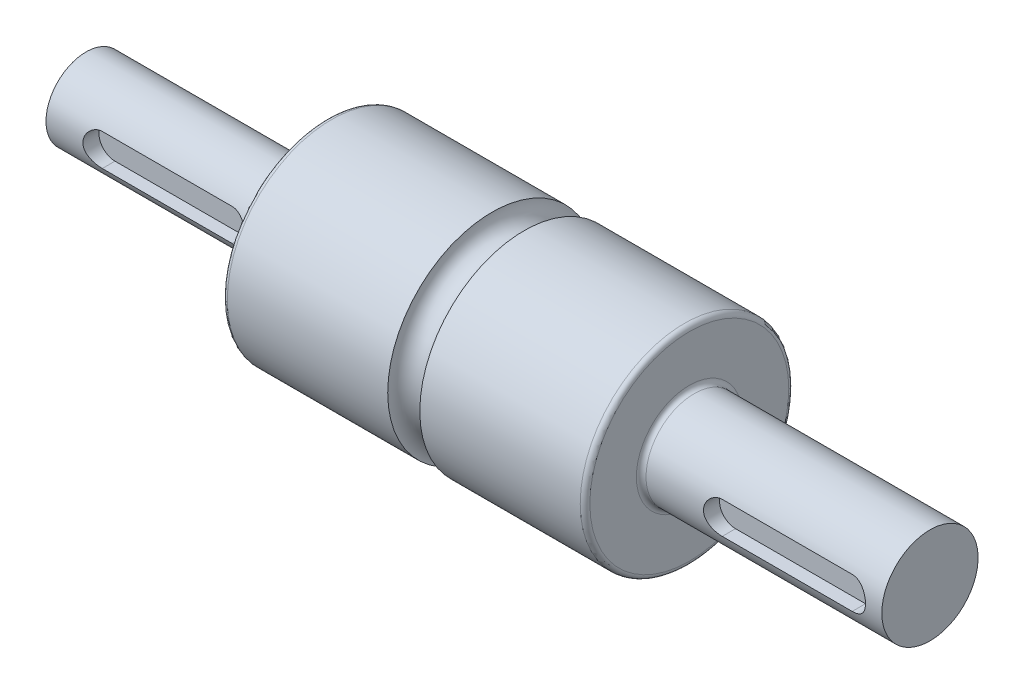
ISO-10303-21;
HEADER;
FILE_DESCRIPTION(('STEP AP214'),'2;1');
FILE_NAME('part.step','',(''),(''),'','','');
FILE_SCHEMA(('AUTOMOTIVE_DESIGN { 1 0 10303 214 1 1 1 1 }'));
ENDSEC;
DATA;
#1=APPLICATION_CONTEXT('core data for automotive mechanical design processes');
#2=APPLICATION_PROTOCOL_DEFINITION('international standard','automotive_design',2000,#1);
#3=PRODUCT_CONTEXT('',#1,'mechanical');
#4=PRODUCT('Part','Part','',(#3));
#5=PRODUCT_RELATED_PRODUCT_CATEGORY('part','',(#4));
#6=PRODUCT_DEFINITION_FORMATION('','',#4);
#7=PRODUCT_DEFINITION_CONTEXT('part definition',#1,'design');
#8=PRODUCT_DEFINITION('design','',#6,#7);
#9=PRODUCT_DEFINITION_SHAPE('','',#8);
#10=(LENGTH_UNIT() NAMED_UNIT(*) SI_UNIT(.MILLI.,.METRE.));
#11=(NAMED_UNIT(*) PLANE_ANGLE_UNIT() SI_UNIT($,.RADIAN.));
#12=(NAMED_UNIT(*) SI_UNIT($,.STERADIAN.) SOLID_ANGLE_UNIT());
#13=UNCERTAINTY_MEASURE_WITH_UNIT(LENGTH_MEASURE(1.E-05),#10,'distance_accuracy_value','');
#14=(GEOMETRIC_REPRESENTATION_CONTEXT(3) GLOBAL_UNCERTAINTY_ASSIGNED_CONTEXT((#13)) GLOBAL_UNIT_ASSIGNED_CONTEXT((#10,
#11,#12)) REPRESENTATION_CONTEXT('',''));
#15=CARTESIAN_POINT('',(0.,0.,0.));
#16=DIRECTION('',(0.,0.,1.));
#17=DIRECTION('',(1.,0.,0.));
#18=AXIS2_PLACEMENT_3D('',#15,#16,#17);
#19=CARTESIAN_POINT('',(-131.5,0.,0.));
#20=DIRECTION('',(-1.,0.,0.));
#21=DIRECTION('',(0.,0.,1.));
#22=AXIS2_PLACEMENT_3D('',#19,#20,#21);
#23=CYLINDRICAL_SURFACE('',#22,12.5);
#24=CARTESIAN_POINT('',(-58.,0.,0.));
#25=DIRECTION('',(-1.,0.,0.));
#26=DIRECTION('',(0.,0.,1.));
#27=AXIS2_PLACEMENT_3D('',#24,#25,#26);
#28=CIRCLE('',#27,12.5);
#29=CARTESIAN_POINT('',(-58.,0.,12.5));
#30=VERTEX_POINT('',#29);
#31=EDGE_CURVE('E153',#30,#30,#28,.T.);
#32=ORIENTED_EDGE('',*,*,#31,.T.);
#33=EDGE_LOOP('',(#32));
#34=FACE_BOUND('',#33,.T.);
#35=CARTESIAN_POINT('',(-131.5,0.,0.));
#36=DIRECTION('',(-1.,0.,0.));
#37=DIRECTION('',(0.,0.,1.));
#38=AXIS2_PLACEMENT_3D('',#35,#36,#37);
#39=CIRCLE('',#38,12.5);
#40=CARTESIAN_POINT('',(-131.5,0.,12.5));
#41=VERTEX_POINT('',#40);
#42=EDGE_CURVE('E143',#41,#41,#39,.T.);
#43=ORIENTED_EDGE('',*,*,#42,.F.);
#44=EDGE_LOOP('',(#43));
#45=FACE_BOUND('',#44,.T.);
#46=CARTESIAN_POINT('',(-74.5,-5.,11.4564392373896));
#47=CARTESIAN_POINT('',(-74.3654875679393,-5.00002116024616,11.4564109509945));
#48=CARTESIAN_POINT('',(-74.2309869354604,-4.99457288869912,11.4588073206432));
#49=CARTESIAN_POINT('',(-73.9630706553256,-4.97289704500258,11.4682409636927));
#50=CARTESIAN_POINT('',(-73.829654614021,-4.956673578293,11.4752764695362));
#51=CARTESIAN_POINT('',(-73.565385135065,-4.91369129558914,11.4937439172796));
#52=CARTESIAN_POINT('',(-73.434523688102,-4.88697412617558,11.5051584758264));
#53=CARTESIAN_POINT('',(-73.1757404220352,-4.82328654884511,11.5320036246689));
#54=CARTESIAN_POINT('',(-73.0478187828872,-4.78631551505478,11.5474344601058));
#55=CARTESIAN_POINT('',(-72.7959206323767,-4.70252103978111,11.5818106822086));
#56=CARTESIAN_POINT('',(-72.6719391040064,-4.65571075709793,11.6007513709062));
#57=CARTESIAN_POINT('',(-72.4284712713783,-4.55261160789531,11.6415978912418));
#58=CARTESIAN_POINT('',(-72.3089866777911,-4.49631917799879,11.6635048369856));
#59=CARTESIAN_POINT('',(-71.9581897596147,-4.31376922877803,11.7327894866887));
#60=CARTESIAN_POINT('',(-71.7345173617548,-4.1738333730516,11.7837334464308));
#61=CARTESIAN_POINT('',(-71.3017980191423,-3.85328699437733,11.8925290853841));
#62=CARTESIAN_POINT('',(-71.0940908043745,-3.67095756312248,11.9506010980043));
#63=CARTESIAN_POINT('',(-70.7111404708298,-3.27420643347806,12.0653248053599));
#64=CARTESIAN_POINT('',(-70.53590401691,-3.05977816286379,12.1219762064459));
#65=CARTESIAN_POINT('',(-70.2978547901685,-2.71343385084917,12.2025476404464));
#66=CARTESIAN_POINT('',(-70.2214331506581,-2.59127203287559,12.229134001304));
#67=CARTESIAN_POINT('',(-70.0792212452284,-2.34039970046137,12.2796116610866));
#68=CARTESIAN_POINT('',(-70.0134265986883,-2.21169191329333,12.3035040692708));
#69=CARTESIAN_POINT('',(-69.8930444134802,-1.94856415474308,12.3479110926869));
#70=CARTESIAN_POINT('',(-69.8384580797531,-1.81414357108402,12.3684253447059));
#71=CARTESIAN_POINT('',(-69.7410599466892,-1.54063203940549,12.4054617264858));
#72=CARTESIAN_POINT('',(-69.6982424200689,-1.4015434002045,12.4219857975888));
#73=CARTESIAN_POINT('',(-69.6265804994886,-1.12649875188941,12.4498667432373));
#74=CARTESIAN_POINT('',(-69.5971639159328,-0.990712972335591,12.4614336192513));
#75=CARTESIAN_POINT('',(-69.5497158745245,-0.716923447431963,12.480177753411));
#76=CARTESIAN_POINT('',(-69.5316794352604,-0.578920699676963,12.4873569321328));
#77=CARTESIAN_POINT('',(-69.5071744672548,-0.30174292808369,12.4971268844119));
#78=CARTESIAN_POINT('',(-69.5007048393492,-0.162568016896006,12.4997180939517));
#79=CARTESIAN_POINT('',(-69.4994043250122,0.115842484012891,12.5002382405049));
#80=CARTESIAN_POINT('',(-69.5045730295164,0.255078071429478,12.4981673413824));
#81=CARTESIAN_POINT('',(-69.5258691853457,0.524651970400596,12.4896713366005));
#82=CARTESIAN_POINT('',(-69.5413617516848,0.655048966944773,12.4834985427991));
#83=CARTESIAN_POINT('',(-69.5825047096151,0.914022837957911,12.4672131439381));
#84=CARTESIAN_POINT('',(-69.6081584769187,1.04259909282981,12.4570992295938));
#85=CARTESIAN_POINT('',(-69.6693736722391,1.29697755626972,12.4331876533791));
#86=CARTESIAN_POINT('',(-69.7049316760065,1.4227807074059,12.4193912647406));
#87=CARTESIAN_POINT('',(-69.7856340431202,1.67086757221276,12.3884570972524));
#88=CARTESIAN_POINT('',(-69.830782047088,1.79314992921958,12.3713180496423));
#89=CARTESIAN_POINT('',(-69.9815458342561,2.15709687028237,12.3149325863107));
#90=CARTESIAN_POINT('',(-70.1016086222678,2.39225143382088,12.2710729537441));
#91=CARTESIAN_POINT('',(-70.3761759563323,2.83955938188382,12.175361464094));
#92=CARTESIAN_POINT('',(-70.5306925854217,3.05170465810884,12.1235068051106));
#93=CARTESIAN_POINT('',(-70.881596586143,3.46189166322706,12.0130472510456));
#94=CARTESIAN_POINT('',(-71.0800653571789,3.65809600081914,11.9542226888217));
#95=CARTESIAN_POINT('',(-71.5074910854606,4.01527141902245,11.8390417472991));
#96=CARTESIAN_POINT('',(-71.736461856538,4.17622644798532,11.7826865017702));
#97=CARTESIAN_POINT('',(-72.1020444660322,4.38982639253539,11.7040767056709));
#98=CARTESIAN_POINT('',(-72.2295897678493,4.45714070918036,11.67853963431));
#99=CARTESIAN_POINT('',(-72.4904903947145,4.58068459393734,11.6306369662179));
#100=CARTESIAN_POINT('',(-72.6238431849912,4.63691894003213,11.6082700036232));
#101=CARTESIAN_POINT('',(-72.8952861568295,4.73770315812053,11.5675031334143));
#102=CARTESIAN_POINT('',(-73.0333702108564,4.78226754199411,11.5490983039106));
#103=CARTESIAN_POINT('',(-73.3133354618804,4.85931060760166,11.5168933461878));
#104=CARTESIAN_POINT('',(-73.4552149257571,4.89179470795396,11.5030911537407));
#105=CARTESIAN_POINT('',(-73.7468068086629,4.94524241843461,11.4802224777034));
#106=CARTESIAN_POINT('',(-73.8966177429504,4.96575156895815,11.4713433844497));
#107=CARTESIAN_POINT('',(-74.1976136616756,4.9931431059651,11.4594310700134));
#108=CARTESIAN_POINT('',(-74.3487977416618,5.0000338891365,11.4563942466884));
#109=CARTESIAN_POINT('',(-74.5,5.,11.4564392373896));
#110=B_SPLINE_CURVE_WITH_KNOTS('',3,(#46,#47,#48,#49,#50,#51,#52,#53,#54,#55,#56,#57,#58,#59,
#60,#61,#62,#63,#64,#65,#66,#67,#68,#69,#70,#71,#72,#73,#74,#75,#76,#77,#78,#79,#80,#81,#82,#83,
#84,#85,#86,#87,#88,#89,#90,#91,#92,#93,#94,#95,#96,#97,#98,#99,#100,#101,#102,#103,#104,#105,
#106,#107,#108,#109),.UNSPECIFIED.,.F.,.F.,(4,2,2,2,2,2,2,2,2,2,2,2,2,2,2,2,2,2,2,2,2,2,2,2,2,2,
2,2,2,2,2,4),(0.,0.403387132772953,0.806620659758034,1.20826977817943,1.60994341778078,
2.01108324721979,2.4123741621189,3.21490253133681,4.05861785764907,4.90250617122559,
5.34163056425766,5.780573478467,6.21956355621627,6.6583396199058,7.0760486126647,
7.49357463528175,7.91106097937957,8.32853264988812,8.72244552722558,9.11648937858482,
9.51039716361132,9.90445475472554,10.7036301452728,11.5030862504097,12.3549725889497,
13.2072460521693,13.6461605184396,14.0848852966823,14.5230618911476,14.9610417034976,
15.4147136276398,15.8681057435335),.UNSPECIFIED.);
#111=CARTESIAN_POINT('',(-74.5,-5.,11.4564392373896));
#112=VERTEX_POINT('',#111);
#113=CARTESIAN_POINT('',(-74.5,5.,11.4564392373896));
#114=VERTEX_POINT('',#113);
#115=EDGE_CURVE('E186',#112,#114,#110,.T.);
#116=ORIENTED_EDGE('',*,*,#115,.F.);
#117=DIRECTION('',(-1.,0.,0.));
#118=VECTOR('',#117,1.);
#119=CARTESIAN_POINT('',(-131.5,-5.,11.4564392373896));
#120=LINE('',#119,#118);
#121=CARTESIAN_POINT('',(-115.,-5.,11.4564392373896));
#122=VERTEX_POINT('',#121);
#123=EDGE_CURVE('E219',#112,#122,#120,.T.);
#124=ORIENTED_EDGE('',*,*,#123,.T.);
#125=CARTESIAN_POINT('',(-115.,-5.,11.4564392373896));
#126=CARTESIAN_POINT('',(-115.134512432061,-5.00002116024616,11.4564109509945));
#127=CARTESIAN_POINT('',(-115.26901306454,-4.99457288869912,11.4588073206432));
#128=CARTESIAN_POINT('',(-115.536929344674,-4.97289704500258,11.4682409636927));
#129=CARTESIAN_POINT('',(-115.670345385979,-4.956673578293,11.4752764695362));
#130=CARTESIAN_POINT('',(-115.934614864935,-4.91369129558914,11.4937439172796));
#131=CARTESIAN_POINT('',(-116.065476311898,-4.88697412617558,11.5051584758264));
#132=CARTESIAN_POINT('',(-116.324259577965,-4.82328654884511,11.5320036246689));
#133=CARTESIAN_POINT('',(-116.452181217113,-4.78631551505478,11.5474344601058));
#134=CARTESIAN_POINT('',(-116.704079367623,-4.70252103978111,11.5818106822086));
#135=CARTESIAN_POINT('',(-116.828060895994,-4.65571075709793,11.6007513709062));
#136=CARTESIAN_POINT('',(-117.071528728622,-4.5526116078953,11.6415978912418));
#137=CARTESIAN_POINT('',(-117.191013322209,-4.49631917799879,11.6635048369856));
#138=CARTESIAN_POINT('',(-117.541810240385,-4.31376922877802,11.7327894866887));
#139=CARTESIAN_POINT('',(-117.765482638245,-4.1738333730516,11.7837334464308));
#140=CARTESIAN_POINT('',(-118.198201980858,-3.85328699437734,11.8925290853841));
#141=CARTESIAN_POINT('',(-118.405909195625,-3.67095756312248,11.9506010980043));
#142=CARTESIAN_POINT('',(-118.78885952917,-3.27420643347806,12.0653248053599));
#143=CARTESIAN_POINT('',(-118.96409598309,-3.05977816286379,12.1219762064459));
#144=CARTESIAN_POINT('',(-119.202145209832,-2.71343385084917,12.2025476404464));
#145=CARTESIAN_POINT('',(-119.278566849342,-2.59127203287559,12.229134001304));
#146=CARTESIAN_POINT('',(-119.420778754772,-2.34039970046137,12.2796116610866));
#147=CARTESIAN_POINT('',(-119.486573401312,-2.21169191329333,12.3035040692708));
#148=CARTESIAN_POINT('',(-119.60695558652,-1.94856415474308,12.3479110926869));
#149=CARTESIAN_POINT('',(-119.661541920247,-1.81414357108402,12.3684253447059));
#150=CARTESIAN_POINT('',(-119.758940053311,-1.54063203940549,12.4054617264858));
#151=CARTESIAN_POINT('',(-119.801757579931,-1.4015434002045,12.4219857975888));
#152=CARTESIAN_POINT('',(-119.873419500511,-1.12649875188941,12.4498667432373));
#153=CARTESIAN_POINT('',(-119.902836084067,-0.990712972335592,12.4614336192513));
#154=CARTESIAN_POINT('',(-119.950284125476,-0.716923447431964,12.480177753411));
#155=CARTESIAN_POINT('',(-119.96832056474,-0.578920699676964,12.4873569321328));
#156=CARTESIAN_POINT('',(-119.992825532745,-0.30174292808369,12.4971268844119));
#157=CARTESIAN_POINT('',(-119.999295160651,-0.162568016896007,12.4997180939517));
#158=CARTESIAN_POINT('',(-120.000595674988,0.115842484012891,12.5002382405049));
#159=CARTESIAN_POINT('',(-119.995426970484,0.255078071429478,12.4981673413824));
#160=CARTESIAN_POINT('',(-119.974130814654,0.524651970400596,12.4896713366005));
#161=CARTESIAN_POINT('',(-119.958638248315,0.655048966944773,12.4834985427991));
#162=CARTESIAN_POINT('',(-119.917495290385,0.91402283795791,12.4672131439381));
#163=CARTESIAN_POINT('',(-119.891841523081,1.04259909282981,12.4570992295938));
#164=CARTESIAN_POINT('',(-119.830626327761,1.29697755626972,12.4331876533791));
#165=CARTESIAN_POINT('',(-119.795068323994,1.42278070740589,12.4193912647406));
#166=CARTESIAN_POINT('',(-119.71436595688,1.67086757221276,12.3884570972524));
#167=CARTESIAN_POINT('',(-119.669217952912,1.79314992921958,12.3713180496423));
#168=CARTESIAN_POINT('',(-119.518454165744,2.15709687028237,12.3149325863107));
#169=CARTESIAN_POINT('',(-119.398391377732,2.39225143382088,12.2710729537441));
#170=CARTESIAN_POINT('',(-119.123824043668,2.83955938188382,12.175361464094));
#171=CARTESIAN_POINT('',(-118.969307414578,3.05170465810884,12.1235068051106));
#172=CARTESIAN_POINT('',(-118.618403413857,3.46189166322706,12.0130472510456));
#173=CARTESIAN_POINT('',(-118.419934642821,3.65809600081914,11.9542226888217));
#174=CARTESIAN_POINT('',(-117.992508914539,4.01527141902245,11.8390417472991));
#175=CARTESIAN_POINT('',(-117.763538143462,4.17622644798532,11.7826865017702));
#176=CARTESIAN_POINT('',(-117.397955533968,4.38982639253539,11.7040767056709));
#177=CARTESIAN_POINT('',(-117.270410232151,4.45714070918036,11.67853963431));
#178=CARTESIAN_POINT('',(-117.009509605286,4.58068459393734,11.6306369662179));
#179=CARTESIAN_POINT('',(-116.876156815009,4.63691894003213,11.6082700036232));
#180=CARTESIAN_POINT('',(-116.60471384317,4.73770315812053,11.5675031334143));
#181=CARTESIAN_POINT('',(-116.466629789144,4.78226754199411,11.5490983039106));
#182=CARTESIAN_POINT('',(-116.18666453812,4.85931060760166,11.5168933461878));
#183=CARTESIAN_POINT('',(-116.044785074243,4.89179470795396,11.5030911537407));
#184=CARTESIAN_POINT('',(-115.753193191337,4.94524241843461,11.4802224777034));
#185=CARTESIAN_POINT('',(-115.60338225705,4.96575156895815,11.4713433844497));
#186=CARTESIAN_POINT('',(-115.302386338324,4.9931431059651,11.4594310700134));
#187=CARTESIAN_POINT('',(-115.151202258338,5.0000338891365,11.4563942466884));
#188=CARTESIAN_POINT('',(-115.,5.,11.4564392373896));
#189=B_SPLINE_CURVE_WITH_KNOTS('',3,(#125,#126,#127,#128,#129,#130,#131,#132,#133,#134,#135,
#136,#137,#138,#139,#140,#141,#142,#143,#144,#145,#146,#147,#148,#149,#150,#151,#152,#153,#154,
#155,#156,#157,#158,#159,#160,#161,#162,#163,#164,#165,#166,#167,#168,#169,#170,#171,#172,#173,
#174,#175,#176,#177,#178,#179,#180,#181,#182,#183,#184,#185,#186,#187,#188),.UNSPECIFIED.,.F.,
.F.,(4,2,2,2,2,2,2,2,2,2,2,2,2,2,2,2,2,2,2,2,2,2,2,2,2,2,2,2,2,2,2,4),(0.,0.403387132772953,
0.806620659758034,1.20826977817943,1.60994341778078,2.01108324721979,2.41237416211891,
3.21490253133681,4.05861785764907,4.90250617122559,5.34163056425766,5.780573478467,
6.21956355621626,6.6583396199058,7.0760486126647,7.49357463528175,7.91106097937957,
8.32853264988812,8.72244552722558,9.11648937858482,9.51039716361132,9.90445475472554,
10.7036301452728,11.5030862504097,12.3549725889497,13.2072460521693,13.6461605184396,
14.0848852966823,14.5230618911476,14.9610417034976,15.4147136276398,15.8681057435335),.UNSPECIFIED.);
#190=CARTESIAN_POINT('',(-115.,5.,11.4564392373896));
#191=VERTEX_POINT('',#190);
#192=EDGE_CURVE('E56',#122,#191,#189,.T.);
#193=ORIENTED_EDGE('',*,*,#192,.T.);
#194=DIRECTION('',(-1.,0.,0.));
#195=VECTOR('',#194,1.);
#196=CARTESIAN_POINT('',(-131.5,5.,11.4564392373896));
#197=LINE('',#196,#195);
#198=EDGE_CURVE('E193',#114,#191,#197,.T.);
#199=ORIENTED_EDGE('',*,*,#198,.F.);
#200=EDGE_LOOP('',(#116,#124,#193,#199));
#201=FACE_BOUND('',#200,.T.);
#202=ADVANCED_FACE('F33',(#34,#45,#201),#23,.T.);
#203=CARTESIAN_POINT('',(131.5,0.,-15.));
#204=DIRECTION('',(-1.,0.,0.));
#205=DIRECTION('',(0.,0.,1.));
#206=AXIS2_PLACEMENT_3D('',#203,#204,#205);
#207=PLANE('',#206);
#208=CARTESIAN_POINT('',(131.5,0.,0.));
#209=DIRECTION('',(-1.,0.,0.));
#210=DIRECTION('',(0.,0.,1.));
#211=AXIS2_PLACEMENT_3D('',#208,#209,#210);
#212=CIRCLE('',#211,15.);
#213=CARTESIAN_POINT('',(131.5,0.,15.));
#214=VERTEX_POINT('',#213);
#215=EDGE_CURVE('E183',#214,#214,#212,.T.);
#216=ORIENTED_EDGE('',*,*,#215,.F.);
#217=EDGE_LOOP('',(#216));
#218=FACE_BOUND('',#217,.T.);
#219=ADVANCED_FACE('F35',(#218),#207,.F.);
#220=CARTESIAN_POINT('',(-131.5,0.,0.));
#221=DIRECTION('',(-1.,0.,0.));
#222=DIRECTION('',(0.,0.,1.));
#223=AXIS2_PLACEMENT_3D('',#220,#221,#222);
#224=CYLINDRICAL_SURFACE('',#223,15.);
#225=DIRECTION('',(-1.,0.,0.));
#226=VECTOR('',#225,1.);
#227=CARTESIAN_POINT('',(-131.5,5.00000000000001,14.1421356237309));
#228=LINE('',#227,#226);
#229=CARTESIAN_POINT('',(80.9034269419929,5.00000000000001,14.1421356237309));
#230=VERTEX_POINT('',#229);
#231=CARTESIAN_POINT('',(121.403426941993,5.00000000000001,14.1421356237309));
#232=VERTEX_POINT('',#231);
#233=EDGE_CURVE('E11',#230,#232,#228,.F.);
#234=ORIENTED_EDGE('',*,*,#233,.T.);
#235=CARTESIAN_POINT('',(121.403426941993,5.00000000000001,14.1421356237309));
#236=CARTESIAN_POINT('',(121.5398387699,5.00001928272081,14.1421132795953));
#237=CARTESIAN_POINT('',(121.676241927634,4.99441839460029,14.144108585197));
#238=CARTESIAN_POINT('',(121.947990182087,4.97212026561632,14.1519707752355));
#239=CARTESIAN_POINT('',(122.083335554446,4.95542602013329,14.1578366145644));
#240=CARTESIAN_POINT('',(122.351605599094,4.9111504844288,14.1732535212275));
#241=CARTESIAN_POINT('',(122.484536238896,4.88360148534077,14.182793656248));
#242=CARTESIAN_POINT('',(122.74745158765,4.81787909036064,14.2052544389481));
#243=CARTESIAN_POINT('',(122.877436189951,4.7797053104926,14.2181752088016));
#244=CARTESIAN_POINT('',(123.133485940323,4.69309505128878,14.2469974292543));
#245=CARTESIAN_POINT('',(123.259554161886,4.64466686529956,14.2628964699579));
#246=CARTESIAN_POINT('',(123.507095489933,4.53792631398364,14.2972152683245));
#247=CARTESIAN_POINT('',(123.628566861094,4.47961026060575,14.3156359660384));
#248=CARTESIAN_POINT('',(123.984995870406,4.29042487291369,14.3739242294785));
#249=CARTESIAN_POINT('',(124.212077125632,4.14528130436111,14.4168308914588));
#250=CARTESIAN_POINT('',(124.647064812331,3.81524041281302,14.5077282855086));
#251=CARTESIAN_POINT('',(124.854011190976,3.62912046165337,14.5558450324036));
#252=CARTESIAN_POINT('',(125.23444718253,3.22494665570409,14.6506912904573));
#253=CARTESIAN_POINT('',(125.407930837861,3.00688712664706,14.6974205533428));
#254=CARTESIAN_POINT('',(125.720827276125,2.53801699448505,14.7856944680589));
#255=CARTESIAN_POINT('',(125.859232598254,2.28650011670838,14.8270719634014));
#256=CARTESIAN_POINT('',(126.091387466404,1.76214657981263,14.8984803449503));
#257=CARTESIAN_POINT('',(126.18515065388,1.48931646315736,14.9285146967399));
#258=CARTESIAN_POINT('',(126.322105762804,0.940146645163432,14.9729535792742));
#259=CARTESIAN_POINT('',(126.366943369091,0.664259156539295,14.9878654569488));
#260=CARTESIAN_POINT('',(126.410008370307,0.108494863035997,15.0021804126725));
#261=CARTESIAN_POINT('',(126.40824687138,-0.171380975391754,15.0015871861129));
#262=CARTESIAN_POINT('',(126.359205590794,-0.715519207983796,14.9853019394036));
#263=CARTESIAN_POINT('',(126.31371394512,-0.979963426373997,14.9702030725849));
#264=CARTESIAN_POINT('',(126.181460755688,-1.49722040864169,14.9273480020182));
#265=CARTESIAN_POINT('',(126.094696923543,-1.75003252671054,14.8995910964333));
#266=CARTESIAN_POINT('',(125.881320810713,-2.24076278220397,14.8337834991293));
#267=CARTESIAN_POINT('',(125.754199404086,-2.47844127676372,14.7956022127902));
#268=CARTESIAN_POINT('',(125.464124496602,-2.92962419733436,14.7129190630403));
#269=CARTESIAN_POINT('',(125.301161248662,-3.14312202351081,14.6684154814678));
#270=CARTESIAN_POINT('',(124.935082201863,-3.55048180391257,14.5753148518701));
#271=CARTESIAN_POINT('',(124.730439304146,-3.7429493917037,14.5266237190253));
#272=CARTESIAN_POINT('',(124.291179400284,-4.09137879648189,14.4323697370697));
#273=CARTESIAN_POINT('',(124.056552748239,-4.24732881968221,14.3868079019513));
#274=CARTESIAN_POINT('',(123.685035754024,-4.45137197181609,14.3244699574743));
#275=CARTESIAN_POINT('',(123.556857686034,-4.51477947987291,14.3045606178995));
#276=CARTESIAN_POINT('',(123.295220715797,-4.63050119526382,14.2675208843929));
#277=CARTESIAN_POINT('',(123.161764039398,-4.68282002045477,14.2503893343581));
#278=CARTESIAN_POINT('',(122.890655583785,-4.77584283639461,14.2194841629367));
#279=CARTESIAN_POINT('',(122.753008550613,-4.81655946314395,14.205706890793));
#280=CARTESIAN_POINT('',(122.474466748934,-4.88604801985986,14.1819560641116));
#281=CARTESIAN_POINT('',(122.333573494541,-4.91482540411387,14.1719807728584));
#282=CARTESIAN_POINT('',(122.061373883805,-4.95827453687229,14.156836654448));
#283=CARTESIAN_POINT('',(121.93024004252,-4.97391718926364,14.1513381564974));
#284=CARTESIAN_POINT('',(121.667216526118,-4.99478118687353,14.143980412972));
#285=CARTESIAN_POINT('',(121.535328047408,-5.00001597952915,14.1421164714419));
#286=CARTESIAN_POINT('',(121.403426941993,-4.99999999999999,14.142135623731));
#287=B_SPLINE_CURVE_WITH_KNOTS('',3,(#235,#236,#237,#238,#239,#240,#241,#242,#243,#244,#245,
#246,#247,#248,#249,#250,#251,#252,#253,#254,#255,#256,#257,#258,#259,#260,#261,#262,#263,#264,
#265,#266,#267,#268,#269,#270,#271,#272,#273,#274,#275,#276,#277,#278,#279,#280,#281,#282,#283,
#284,#285,#286),.UNSPECIFIED.,.F.,.F.,(4,2,2,2,2,2,2,2,2,2,2,2,2,2,2,2,2,2,2,2,2,2,2,2,2,4),(0.,
0.409092423677147,0.818074430847297,1.22584885885814,1.63363802561077,2.04109864022585,
2.44871156823775,3.26359482908313,4.10724851154042,4.95105225659391,5.8168799100616,
6.68244281946291,7.5178967997767,8.35315166493869,9.15564418669333,9.95818120881897,
10.7712742047049,11.584588592845,12.4361259663091,13.2879379758687,13.7206337000479,
14.1531488734623,14.5851911765746,15.0170358888757,15.4131122811713,15.8086765909866),.UNSPECIFIED.);
#288=CARTESIAN_POINT('',(121.403426941993,-4.99999999999999,14.142135623731));
#289=VERTEX_POINT('',#288);
#290=EDGE_CURVE('E222',#232,#289,#287,.T.);
#291=ORIENTED_EDGE('',*,*,#290,.T.);
#292=DIRECTION('',(-1.,0.,0.));
#293=VECTOR('',#292,1.);
#294=CARTESIAN_POINT('',(-131.5,-4.99999999999999,14.142135623731));
#295=LINE('',#294,#293);
#296=CARTESIAN_POINT('',(80.9034269419929,-4.99999999999999,14.142135623731));
#297=VERTEX_POINT('',#296);
#298=EDGE_CURVE('E41',#289,#297,#295,.T.);
#299=ORIENTED_EDGE('',*,*,#298,.T.);
#300=CARTESIAN_POINT('',(80.9034269419929,-4.99999999999999,14.142135623731));
#301=CARTESIAN_POINT('',(80.767015114086,-5.0000192827208,14.1421132795953));
#302=CARTESIAN_POINT('',(80.6306119563519,-4.99441839460027,14.144108585197));
#303=CARTESIAN_POINT('',(80.3588637018987,-4.97212026561631,14.1519707752355));
#304=CARTESIAN_POINT('',(80.2235183295394,-4.95542602013328,14.1578366145644));
#305=CARTESIAN_POINT('',(79.9552482848919,-4.91115048442879,14.1732535212275));
#306=CARTESIAN_POINT('',(79.82231764509,-4.88360148534076,14.182793656248));
#307=CARTESIAN_POINT('',(79.5594022963353,-4.81787909036063,14.2052544389481));
#308=CARTESIAN_POINT('',(79.4294176940349,-4.77970531049259,14.2181752088016));
#309=CARTESIAN_POINT('',(79.173367943663,-4.69309505128877,14.2469974292543));
#310=CARTESIAN_POINT('',(79.0472997220997,-4.64466686529955,14.2628964699579));
#311=CARTESIAN_POINT('',(78.7997583940527,-4.53792631398363,14.2972152683245));
#312=CARTESIAN_POINT('',(78.6782870228913,-4.47961026060575,14.3156359660384));
#313=CARTESIAN_POINT('',(78.3218580135801,-4.29042487291369,14.3739242294785));
#314=CARTESIAN_POINT('',(78.094776758354,-4.14528130436111,14.4168308914588));
#315=CARTESIAN_POINT('',(77.6597890716549,-3.81524041281301,14.5077282855086));
#316=CARTESIAN_POINT('',(77.45284269301,-3.62912046165336,14.5558450324036));
#317=CARTESIAN_POINT('',(77.0724067014556,-3.22494665570406,14.6506912904573));
#318=CARTESIAN_POINT('',(76.8989230461245,-3.00688712664704,14.6974205533428));
#319=CARTESIAN_POINT('',(76.5860266078608,-2.53801699448503,14.7856944680589));
#320=CARTESIAN_POINT('',(76.4476212857322,-2.28650011670835,14.8270719634014));
#321=CARTESIAN_POINT('',(76.2154664175814,-1.7621465798126,14.8984803449503));
#322=CARTESIAN_POINT('',(76.1217032301055,-1.48931646315734,14.9285146967399));
#323=CARTESIAN_POINT('',(75.9847481211813,-0.940146645163422,14.9729535792742));
#324=CARTESIAN_POINT('',(75.9399105148952,-0.664259156539287,14.9878654569488));
#325=CARTESIAN_POINT('',(75.8968455136787,-0.108494863035997,15.0021804126725));
#326=CARTESIAN_POINT('',(75.8986070126052,0.171380975391749,15.0015871861129));
#327=CARTESIAN_POINT('',(75.9476482931914,0.715519207983782,14.9853019394036));
#328=CARTESIAN_POINT('',(75.9931399388661,0.979963426373979,14.9702030725849));
#329=CARTESIAN_POINT('',(76.1253931282982,1.49722040864167,14.9273480020182));
#330=CARTESIAN_POINT('',(76.2121569604428,1.75003252671053,14.8995910964333));
#331=CARTESIAN_POINT('',(76.4255330732724,2.24076278220396,14.8337834991293));
#332=CARTESIAN_POINT('',(76.5526544798993,2.47844127676371,14.7956022127902));
#333=CARTESIAN_POINT('',(76.8427293873832,2.92962419733436,14.7129190630403));
#334=CARTESIAN_POINT('',(77.0056926353233,3.1431220235108,14.6684154814678));
#335=CARTESIAN_POINT('',(77.3717716821229,3.55048180391257,14.5753148518701));
#336=CARTESIAN_POINT('',(77.5764145798401,3.7429493917037,14.5266237190253));
#337=CARTESIAN_POINT('',(78.0156744837014,4.09137879648189,14.4323697370697));
#338=CARTESIAN_POINT('',(78.2503011357472,4.24732881968221,14.3868079019513));
#339=CARTESIAN_POINT('',(78.6218181299618,4.45137197181609,14.3244699574743));
#340=CARTESIAN_POINT('',(78.7499961979514,4.51477947987291,14.3045606178995));
#341=CARTESIAN_POINT('',(79.0116331681888,4.63050119526382,14.2675208843929));
#342=CARTESIAN_POINT('',(79.1450898445874,4.68282002045477,14.2503893343581));
#343=CARTESIAN_POINT('',(79.4161983002006,4.77584283639461,14.2194841629367));
#344=CARTESIAN_POINT('',(79.5538453333728,4.81655946314395,14.205706890793));
#345=CARTESIAN_POINT('',(79.832387135052,4.88604801985987,14.1819560641116));
#346=CARTESIAN_POINT('',(79.973280389445,4.91482540411388,14.1719807728584));
#347=CARTESIAN_POINT('',(80.2454800001812,4.9582745368723,14.1568366544479));
#348=CARTESIAN_POINT('',(80.3766138414661,4.97391718926365,14.1513381564974));
#349=CARTESIAN_POINT('',(80.6396373578676,4.99478118687354,14.143980412972));
#350=CARTESIAN_POINT('',(80.7715258365777,5.00001597952917,14.1421164714419));
#351=CARTESIAN_POINT('',(80.9034269419929,5.00000000000001,14.1421356237309));
#352=B_SPLINE_CURVE_WITH_KNOTS('',3,(#300,#301,#302,#303,#304,#305,#306,#307,#308,#309,#310,
#311,#312,#313,#314,#315,#316,#317,#318,#319,#320,#321,#322,#323,#324,#325,#326,#327,#328,#329,
#330,#331,#332,#333,#334,#335,#336,#337,#338,#339,#340,#341,#342,#343,#344,#345,#346,#347,#348,
#349,#350,#351),.UNSPECIFIED.,.F.,.F.,(4,2,2,2,2,2,2,2,2,2,2,2,2,2,2,2,2,2,2,2,2,2,2,2,2,4),(0.,
0.409092423677161,0.818074430847311,1.22584885885817,1.63363802561077,2.04109864022585,
2.44871156823775,3.26359482908312,4.10724851154045,4.95105225659394,5.81687991006164,
6.68244281946293,7.51789679977671,8.35315166493868,9.15564418669332,9.95818120881896,
10.771274204705,11.584588592845,12.4361259663091,13.2879379758687,13.7206337000479,
14.1531488734623,14.5851911765746,15.0170358888757,15.4131122811714,15.8086765909867),.UNSPECIFIED.);
#353=EDGE_CURVE('E48',#297,#230,#352,.T.);
#354=ORIENTED_EDGE('',*,*,#353,.T.);
#355=EDGE_LOOP('',(#234,#291,#299,#354));
#356=FACE_BOUND('',#355,.T.);
#357=CARTESIAN_POINT('',(58.,0.,0.));
#358=DIRECTION('',(-1.,0.,0.));
#359=DIRECTION('',(0.,0.,1.));
#360=AXIS2_PLACEMENT_3D('',#357,#358,#359);
#361=CIRCLE('',#360,15.);
#362=CARTESIAN_POINT('',(58.,0.,15.));
#363=VERTEX_POINT('',#362);
#364=EDGE_CURVE('E180',#363,#363,#361,.T.);
#365=ORIENTED_EDGE('',*,*,#364,.F.);
#366=EDGE_LOOP('',(#365));
#367=FACE_BOUND('',#366,.T.);
#368=ORIENTED_EDGE('',*,*,#215,.T.);
#369=EDGE_LOOP('',(#368));
#370=FACE_BOUND('',#369,.T.);
#371=ADVANCED_FACE('F233',(#356,#367,#370),#224,.T.);
#372=CARTESIAN_POINT('',(58.,0.,0.));
#373=DIRECTION('',(-1.,0.,0.));
#374=DIRECTION('',(0.,0.,1.));
#375=AXIS2_PLACEMENT_3D('',#372,#373,#374);
#376=TOROIDAL_SURFACE('',#375,16.5,1.5);
#377=CARTESIAN_POINT('',(56.5,0.,0.));
#378=DIRECTION('',(-1.,0.,0.));
#379=DIRECTION('',(0.,0.,1.));
#380=AXIS2_PLACEMENT_3D('',#377,#378,#379);
#381=CIRCLE('',#380,16.5);
#382=CARTESIAN_POINT('',(56.5,0.,16.5));
#383=VERTEX_POINT('',#382);
#384=EDGE_CURVE('E177',#383,#383,#381,.T.);
#385=ORIENTED_EDGE('',*,*,#384,.F.);
#386=EDGE_LOOP('',(#385));
#387=FACE_BOUND('',#386,.T.);
#388=ORIENTED_EDGE('',*,*,#364,.T.);
#389=EDGE_LOOP('',(#388));
#390=FACE_BOUND('',#389,.T.);
#391=ADVANCED_FACE('F298',(#387,#390),#376,.F.);
#392=CARTESIAN_POINT('',(56.5,0.,-31.));
#393=DIRECTION('',(-1.,0.,0.));
#394=DIRECTION('',(0.,0.,1.));
#395=AXIS2_PLACEMENT_3D('',#392,#393,#394);
#396=PLANE('',#395);
#397=CARTESIAN_POINT('',(56.5,0.,0.));
#398=DIRECTION('',(-1.,0.,0.));
#399=DIRECTION('',(0.,0.,1.));
#400=AXIS2_PLACEMENT_3D('',#397,#398,#399);
#401=CIRCLE('',#400,31.);
#402=CARTESIAN_POINT('',(56.5,0.,31.));
#403=VERTEX_POINT('',#402);
#404=EDGE_CURVE('E174',#403,#403,#401,.T.);
#405=ORIENTED_EDGE('',*,*,#404,.F.);
#406=EDGE_LOOP('',(#405));
#407=FACE_BOUND('',#406,.T.);
#408=ORIENTED_EDGE('',*,*,#384,.T.);
#409=EDGE_LOOP('',(#408));
#410=FACE_BOUND('',#409,.T.);
#411=ADVANCED_FACE('F342',(#407,#410),#396,.F.);
#412=CARTESIAN_POINT('',(55.,0.,0.));
#413=DIRECTION('',(-1.,0.,0.));
#414=DIRECTION('',(0.,0.,1.));
#415=AXIS2_PLACEMENT_3D('',#412,#413,#414);
#416=TOROIDAL_SURFACE('',#415,31.,1.5);
#417=CARTESIAN_POINT('',(55.,0.,0.));
#418=DIRECTION('',(-1.,0.,0.));
#419=DIRECTION('',(0.,0.,1.));
#420=AXIS2_PLACEMENT_3D('',#417,#418,#419);
#421=CIRCLE('',#420,32.5);
#422=CARTESIAN_POINT('',(55.,0.,32.5));
#423=VERTEX_POINT('',#422);
#424=EDGE_CURVE('E171',#423,#423,#421,.T.);
#425=ORIENTED_EDGE('',*,*,#424,.F.);
#426=EDGE_LOOP('',(#425));
#427=FACE_BOUND('',#426,.T.);
#428=ORIENTED_EDGE('',*,*,#404,.T.);
#429=EDGE_LOOP('',(#428));
#430=FACE_BOUND('',#429,.T.);
#431=ADVANCED_FACE('F347',(#427,#430),#416,.T.);
#432=CARTESIAN_POINT('',(-131.5,0.,0.));
#433=DIRECTION('',(-1.,0.,0.));
#434=DIRECTION('',(0.,0.,1.));
#435=AXIS2_PLACEMENT_3D('',#432,#433,#434);
#436=CYLINDRICAL_SURFACE('',#435,32.5);
#437=CARTESIAN_POINT('',(5.,0.,0.));
#438=DIRECTION('',(-1.,0.,0.));
#439=DIRECTION('',(0.,0.,1.));
#440=AXIS2_PLACEMENT_3D('',#437,#438,#439);
#441=CIRCLE('',#440,32.5);
#442=CARTESIAN_POINT('',(5.,0.,32.5));
#443=VERTEX_POINT('',#442);
#444=EDGE_CURVE('E168',#443,#443,#441,.T.);
#445=ORIENTED_EDGE('',*,*,#444,.F.);
#446=EDGE_LOOP('',(#445));
#447=FACE_BOUND('',#446,.T.);
#448=ORIENTED_EDGE('',*,*,#424,.T.);
#449=EDGE_LOOP('',(#448));
#450=FACE_BOUND('',#449,.T.);
#451=ADVANCED_FACE('F354',(#447,#450),#436,.T.);
#452=CARTESIAN_POINT('',(0.,0.,0.));
#453=DIRECTION('',(-1.,0.,0.));
#454=DIRECTION('',(0.,0.,1.));
#455=AXIS2_PLACEMENT_3D('',#452,#453,#454);
#456=TOROIDAL_SURFACE('',#455,32.5,4.99999999999999);
#457=CARTESIAN_POINT('',(-5.,0.,0.));
#458=DIRECTION('',(-1.,0.,0.));
#459=DIRECTION('',(0.,0.,1.));
#460=AXIS2_PLACEMENT_3D('',#457,#458,#459);
#461=CIRCLE('',#460,32.5);
#462=CARTESIAN_POINT('',(-5.,0.,32.5));
#463=VERTEX_POINT('',#462);
#464=EDGE_CURVE('E165',#463,#463,#461,.T.);
#465=ORIENTED_EDGE('',*,*,#464,.F.);
#466=EDGE_LOOP('',(#465));
#467=FACE_BOUND('',#466,.T.);
#468=ORIENTED_EDGE('',*,*,#444,.T.);
#469=EDGE_LOOP('',(#468));
#470=FACE_BOUND('',#469,.T.);
#471=ADVANCED_FACE('F358',(#467,#470),#456,.F.);
#472=CARTESIAN_POINT('',(-131.5,0.,0.));
#473=DIRECTION('',(-1.,0.,0.));
#474=DIRECTION('',(0.,0.,1.));
#475=AXIS2_PLACEMENT_3D('',#472,#473,#474);
#476=CYLINDRICAL_SURFACE('',#475,32.5);
#477=CARTESIAN_POINT('',(-55.,0.,0.));
#478=DIRECTION('',(-1.,0.,0.));
#479=DIRECTION('',(0.,0.,1.));
#480=AXIS2_PLACEMENT_3D('',#477,#478,#479);
#481=CIRCLE('',#480,32.5);
#482=CARTESIAN_POINT('',(-55.,0.,32.5));
#483=VERTEX_POINT('',#482);
#484=EDGE_CURVE('E162',#483,#483,#481,.T.);
#485=ORIENTED_EDGE('',*,*,#484,.F.);
#486=EDGE_LOOP('',(#485));
#487=FACE_BOUND('',#486,.T.);
#488=ORIENTED_EDGE('',*,*,#464,.T.);
#489=EDGE_LOOP('',(#488));
#490=FACE_BOUND('',#489,.T.);
#491=ADVANCED_FACE('F362',(#487,#490),#476,.T.);
#492=CARTESIAN_POINT('',(-55.,0.,0.));
#493=DIRECTION('',(-1.,0.,0.));
#494=DIRECTION('',(0.,0.,1.));
#495=AXIS2_PLACEMENT_3D('',#492,#493,#494);
#496=TOROIDAL_SURFACE('',#495,31.,1.5);
#497=CARTESIAN_POINT('',(-56.5,0.,0.));
#498=DIRECTION('',(-1.,0.,0.));
#499=DIRECTION('',(0.,0.,1.));
#500=AXIS2_PLACEMENT_3D('',#497,#498,#499);
#501=CIRCLE('',#500,31.);
#502=CARTESIAN_POINT('',(-56.5,0.,31.));
#503=VERTEX_POINT('',#502);
#504=EDGE_CURVE('E159',#503,#503,#501,.T.);
#505=ORIENTED_EDGE('',*,*,#504,.F.);
#506=EDGE_LOOP('',(#505));
#507=FACE_BOUND('',#506,.T.);
#508=ORIENTED_EDGE('',*,*,#484,.T.);
#509=EDGE_LOOP('',(#508));
#510=FACE_BOUND('',#509,.T.);
#511=ADVANCED_FACE('F366',(#507,#510),#496,.T.);
#512=CARTESIAN_POINT('',(-56.5,0.,-14.));
#513=DIRECTION('',(1.,0.,0.));
#514=DIRECTION('',(0.,0.,-1.));
#515=AXIS2_PLACEMENT_3D('',#512,#513,#514);
#516=PLANE('',#515);
#517=CARTESIAN_POINT('',(-56.5,0.,0.));
#518=DIRECTION('',(-1.,0.,0.));
#519=DIRECTION('',(0.,0.,1.));
#520=AXIS2_PLACEMENT_3D('',#517,#518,#519);
#521=CIRCLE('',#520,14.);
#522=CARTESIAN_POINT('',(-56.5,0.,14.));
#523=VERTEX_POINT('',#522);
#524=EDGE_CURVE('E156',#523,#523,#521,.T.);
#525=ORIENTED_EDGE('',*,*,#524,.F.);
#526=EDGE_LOOP('',(#525));
#527=FACE_BOUND('',#526,.T.);
#528=ORIENTED_EDGE('',*,*,#504,.T.);
#529=EDGE_LOOP('',(#528));
#530=FACE_BOUND('',#529,.T.);
#531=ADVANCED_FACE('F370',(#527,#530),#516,.F.);
#532=CARTESIAN_POINT('',(-58.,0.,0.));
#533=DIRECTION('',(-1.,0.,0.));
#534=DIRECTION('',(0.,0.,1.));
#535=AXIS2_PLACEMENT_3D('',#532,#533,#534);
#536=TOROIDAL_SURFACE('',#535,14.,1.5);
#537=ORIENTED_EDGE('',*,*,#31,.F.);
#538=EDGE_LOOP('',(#537));
#539=FACE_BOUND('',#538,.T.);
#540=ORIENTED_EDGE('',*,*,#524,.T.);
#541=EDGE_LOOP('',(#540));
#542=FACE_BOUND('',#541,.T.);
#543=ADVANCED_FACE('F373',(#539,#542),#536,.F.);
#544=CARTESIAN_POINT('',(-131.5,0.,0.));
#545=DIRECTION('',(1.,0.,0.));
#546=DIRECTION('',(0.,0.,-1.));
#547=AXIS2_PLACEMENT_3D('',#544,#545,#546);
#548=PLANE('',#547);
#549=ORIENTED_EDGE('',*,*,#42,.T.);
#550=EDGE_LOOP('',(#549));
#551=FACE_BOUND('',#550,.T.);
#552=ADVANCED_FACE('F214',(#551),#548,.F.);
#553=CARTESIAN_POINT('',(-115.,0.,7.5));
#554=DIRECTION('',(0.,0.,1.));
#555=DIRECTION('',(1.,0.,0.));
#556=AXIS2_PLACEMENT_3D('',#553,#554,#555);
#557=CYLINDRICAL_SURFACE('',#556,5.);
#558=DIRECTION('',(0.,0.,1.));
#559=VECTOR('',#558,1.);
#560=CARTESIAN_POINT('',(-115.,-5.,7.5));
#561=LINE('',#560,#559);
#562=CARTESIAN_POINT('',(-115.,-5.,7.5));
#563=VERTEX_POINT('',#562);
#564=EDGE_CURVE('E140',#563,#122,#561,.T.);
#565=ORIENTED_EDGE('',*,*,#564,.F.);
#566=CARTESIAN_POINT('',(-115.,0.,7.5));
#567=DIRECTION('',(0.,0.,1.));
#568=DIRECTION('',(1.,0.,0.));
#569=AXIS2_PLACEMENT_3D('',#566,#567,#568);
#570=CIRCLE('',#569,5.);
#571=CARTESIAN_POINT('',(-115.,5.,7.5));
#572=VERTEX_POINT('',#571);
#573=EDGE_CURVE('E126',#572,#563,#570,.T.);
#574=ORIENTED_EDGE('',*,*,#573,.F.);
#575=DIRECTION('',(0.,0.,1.));
#576=VECTOR('',#575,1.);
#577=CARTESIAN_POINT('',(-115.,5.,7.5));
#578=LINE('',#577,#576);
#579=EDGE_CURVE('E141',#572,#191,#578,.T.);
#580=ORIENTED_EDGE('',*,*,#579,.T.);
#581=ORIENTED_EDGE('',*,*,#192,.F.);
#582=EDGE_LOOP('',(#565,#574,#580,#581));
#583=FACE_BOUND('',#582,.T.);
#584=ADVANCED_FACE('F211',(#583),#557,.F.);
#585=CARTESIAN_POINT('',(-115.,5.,7.5));
#586=DIRECTION('',(0.,-1.,0.));
#587=DIRECTION('',(0.,0.,-1.));
#588=AXIS2_PLACEMENT_3D('',#585,#586,#587);
#589=PLANE('',#588);
#590=ORIENTED_EDGE('',*,*,#198,.T.);
#591=ORIENTED_EDGE('',*,*,#579,.F.);
#592=DIRECTION('',(1.,0.,0.));
#593=VECTOR('',#592,1.);
#594=CARTESIAN_POINT('',(-115.,5.,7.5));
#595=LINE('',#594,#593);
#596=CARTESIAN_POINT('',(-74.5,5.,7.5));
#597=VERTEX_POINT('',#596);
#598=EDGE_CURVE('E138',#572,#597,#595,.T.);
#599=ORIENTED_EDGE('',*,*,#598,.T.);
#600=DIRECTION('',(0.,0.,1.));
#601=VECTOR('',#600,1.);
#602=CARTESIAN_POINT('',(-74.5,5.,7.5));
#603=LINE('',#602,#601);
#604=EDGE_CURVE('E144',#597,#114,#603,.T.);
#605=ORIENTED_EDGE('',*,*,#604,.T.);
#606=EDGE_LOOP('',(#590,#591,#599,#605));
#607=FACE_BOUND('',#606,.T.);
#608=ADVANCED_FACE('F204',(#607),#589,.T.);
#609=CARTESIAN_POINT('',(-74.5,0.,7.5));
#610=DIRECTION('',(0.,0.,1.));
#611=DIRECTION('',(1.,0.,0.));
#612=AXIS2_PLACEMENT_3D('',#609,#610,#611);
#613=CYLINDRICAL_SURFACE('',#612,5.);
#614=DIRECTION('',(0.,0.,1.));
#615=VECTOR('',#614,1.);
#616=CARTESIAN_POINT('',(-74.5,-5.,7.5));
#617=LINE('',#616,#615);
#618=CARTESIAN_POINT('',(-74.5,-5.,7.5));
#619=VERTEX_POINT('',#618);
#620=EDGE_CURVE('E147',#619,#112,#617,.T.);
#621=ORIENTED_EDGE('',*,*,#620,.T.);
#622=ORIENTED_EDGE('',*,*,#115,.T.);
#623=ORIENTED_EDGE('',*,*,#604,.F.);
#624=CARTESIAN_POINT('',(-74.5,0.,7.5));
#625=DIRECTION('',(0.,0.,-1.));
#626=DIRECTION('',(-1.,0.,0.));
#627=AXIS2_PLACEMENT_3D('',#624,#625,#626);
#628=CIRCLE('',#627,5.);
#629=EDGE_CURVE('E136',#597,#619,#628,.T.);
#630=ORIENTED_EDGE('',*,*,#629,.T.);
#631=EDGE_LOOP('',(#621,#622,#623,#630));
#632=FACE_BOUND('',#631,.T.);
#633=ADVANCED_FACE('F198',(#632),#613,.F.);
#634=CARTESIAN_POINT('',(-115.,-5.,7.5));
#635=DIRECTION('',(0.,-1.,0.));
#636=DIRECTION('',(0.,0.,-1.));
#637=AXIS2_PLACEMENT_3D('',#634,#635,#636);
#638=PLANE('',#637);
#639=ORIENTED_EDGE('',*,*,#620,.F.);
#640=DIRECTION('',(1.,0.,0.));
#641=VECTOR('',#640,1.);
#642=CARTESIAN_POINT('',(-115.,-5.,7.5));
#643=LINE('',#642,#641);
#644=EDGE_CURVE('E133',#563,#619,#643,.T.);
#645=ORIENTED_EDGE('',*,*,#644,.F.);
#646=ORIENTED_EDGE('',*,*,#564,.T.);
#647=ORIENTED_EDGE('',*,*,#123,.F.);
#648=EDGE_LOOP('',(#639,#645,#646,#647));
#649=FACE_BOUND('',#648,.T.);
#650=ADVANCED_FACE('F203',(#649),#638,.F.);
#651=CARTESIAN_POINT('',(-115.,0.,7.5));
#652=DIRECTION('',(0.,0.,1.));
#653=DIRECTION('',(1.,0.,0.));
#654=AXIS2_PLACEMENT_3D('',#651,#652,#653);
#655=PLANE('',#654);
#656=ORIENTED_EDGE('',*,*,#573,.T.);
#657=ORIENTED_EDGE('',*,*,#644,.T.);
#658=ORIENTED_EDGE('',*,*,#629,.F.);
#659=ORIENTED_EDGE('',*,*,#598,.F.);
#660=EDGE_LOOP('',(#656,#657,#658,#659));
#661=FACE_BOUND('',#660,.T.);
#662=ADVANCED_FACE('F209',(#661),#655,.T.);
#663=CARTESIAN_POINT('',(80.9034269419928,0.,10.));
#664=DIRECTION('',(0.,0.,1.));
#665=DIRECTION('',(1.,0.,0.));
#666=AXIS2_PLACEMENT_3D('',#663,#664,#665);
#667=CYLINDRICAL_SURFACE('',#666,5.);
#668=DIRECTION('',(0.,0.,1.));
#669=VECTOR('',#668,1.);
#670=CARTESIAN_POINT('',(80.9034269419929,-4.99999999999999,10.));
#671=LINE('',#670,#669);
#672=CARTESIAN_POINT('',(80.9034269419929,-4.99999999999999,10.));
#673=VERTEX_POINT('',#672);
#674=EDGE_CURVE('E98',#673,#297,#671,.T.);
#675=ORIENTED_EDGE('',*,*,#674,.F.);
#676=CARTESIAN_POINT('',(80.9034269419928,0.,10.));
#677=DIRECTION('',(0.,0.,1.));
#678=DIRECTION('',(1.,0.,0.));
#679=AXIS2_PLACEMENT_3D('',#676,#677,#678);
#680=CIRCLE('',#679,5.);
#681=CARTESIAN_POINT('',(80.9034269419929,5.00000000000001,10.));
#682=VERTEX_POINT('',#681);
#683=EDGE_CURVE('E102',#682,#673,#680,.T.);
#684=ORIENTED_EDGE('',*,*,#683,.F.);
#685=DIRECTION('',(0.,0.,1.));
#686=VECTOR('',#685,1.);
#687=CARTESIAN_POINT('',(80.9034269419929,5.00000000000001,10.));
#688=LINE('',#687,#686);
#689=EDGE_CURVE('E124',#682,#230,#688,.T.);
#690=ORIENTED_EDGE('',*,*,#689,.T.);
#691=ORIENTED_EDGE('',*,*,#353,.F.);
#692=EDGE_LOOP('',(#675,#684,#690,#691));
#693=FACE_BOUND('',#692,.T.);
#694=ADVANCED_FACE('F100',(#693),#667,.F.);
#695=CARTESIAN_POINT('',(80.9034269419929,5.00000000000001,10.));
#696=DIRECTION('',(0.,1.,0.));
#697=DIRECTION('',(0.,0.,1.));
#698=AXIS2_PLACEMENT_3D('',#695,#696,#697);
#699=PLANE('',#698);
#700=ORIENTED_EDGE('',*,*,#689,.F.);
#701=DIRECTION('',(-1.,0.,0.));
#702=VECTOR('',#701,1.);
#703=CARTESIAN_POINT('',(80.9034269419929,5.00000000000001,10.));
#704=LINE('',#703,#702);
#705=CARTESIAN_POINT('',(121.403426941993,5.00000000000001,10.));
#706=VERTEX_POINT('',#705);
#707=EDGE_CURVE('E107',#706,#682,#704,.T.);
#708=ORIENTED_EDGE('',*,*,#707,.F.);
#709=DIRECTION('',(0.,0.,1.));
#710=VECTOR('',#709,1.);
#711=CARTESIAN_POINT('',(121.403426941993,5.00000000000001,10.));
#712=LINE('',#711,#710);
#713=EDGE_CURVE('E127',#706,#232,#712,.T.);
#714=ORIENTED_EDGE('',*,*,#713,.T.);
#715=ORIENTED_EDGE('',*,*,#233,.F.);
#716=EDGE_LOOP('',(#700,#708,#714,#715));
#717=FACE_BOUND('',#716,.T.);
#718=ADVANCED_FACE('F241',(#717),#699,.F.);
#719=CARTESIAN_POINT('',(121.403426941993,0.,10.));
#720=DIRECTION('',(0.,0.,1.));
#721=DIRECTION('',(1.,0.,0.));
#722=AXIS2_PLACEMENT_3D('',#719,#720,#721);
#723=CYLINDRICAL_SURFACE('',#722,5.);
#724=ORIENTED_EDGE('',*,*,#713,.F.);
#725=CARTESIAN_POINT('',(121.403426941993,0.,10.));
#726=DIRECTION('',(0.,0.,1.));
#727=DIRECTION('',(-1.,0.,0.));
#728=AXIS2_PLACEMENT_3D('',#725,#726,#727);
#729=CIRCLE('',#728,5.);
#730=CARTESIAN_POINT('',(121.403426941993,-4.99999999999999,10.));
#731=VERTEX_POINT('',#730);
#732=EDGE_CURVE('E116',#731,#706,#729,.T.);
#733=ORIENTED_EDGE('',*,*,#732,.F.);
#734=DIRECTION('',(0.,0.,1.));
#735=VECTOR('',#734,1.);
#736=CARTESIAN_POINT('',(121.403426941993,-4.99999999999999,10.));
#737=LINE('',#736,#735);
#738=EDGE_CURVE('E106',#731,#289,#737,.T.);
#739=ORIENTED_EDGE('',*,*,#738,.T.);
#740=ORIENTED_EDGE('',*,*,#290,.F.);
#741=EDGE_LOOP('',(#724,#733,#739,#740));
#742=FACE_BOUND('',#741,.T.);
#743=ADVANCED_FACE('F236',(#742),#723,.F.);
#744=CARTESIAN_POINT('',(80.9034269419929,-4.99999999999999,10.));
#745=DIRECTION('',(0.,-1.,0.));
#746=DIRECTION('',(0.,0.,-1.));
#747=AXIS2_PLACEMENT_3D('',#744,#745,#746);
#748=PLANE('',#747);
#749=ORIENTED_EDGE('',*,*,#738,.F.);
#750=DIRECTION('',(1.,0.,0.));
#751=VECTOR('',#750,1.);
#752=CARTESIAN_POINT('',(80.9034269419929,-4.99999999999999,10.));
#753=LINE('',#752,#751);
#754=EDGE_CURVE('E110',#673,#731,#753,.T.);
#755=ORIENTED_EDGE('',*,*,#754,.F.);
#756=ORIENTED_EDGE('',*,*,#674,.T.);
#757=ORIENTED_EDGE('',*,*,#298,.F.);
#758=EDGE_LOOP('',(#749,#755,#756,#757));
#759=FACE_BOUND('',#758,.T.);
#760=ADVANCED_FACE('F111',(#759),#748,.F.);
#761=CARTESIAN_POINT('',(80.9034269419928,0.,10.));
#762=DIRECTION('',(0.,0.,1.));
#763=DIRECTION('',(1.,0.,0.));
#764=AXIS2_PLACEMENT_3D('',#761,#762,#763);
#765=PLANE('',#764);
#766=ORIENTED_EDGE('',*,*,#683,.T.);
#767=ORIENTED_EDGE('',*,*,#754,.T.);
#768=ORIENTED_EDGE('',*,*,#732,.T.);
#769=ORIENTED_EDGE('',*,*,#707,.T.);
#770=EDGE_LOOP('',(#766,#767,#768,#769));
#771=FACE_BOUND('',#770,.T.);
#772=ADVANCED_FACE('F118',(#771),#765,.T.);
#773=CLOSED_SHELL('',(#202,#219,#371,#391,#411,#431,#451,#471,#491,#511,#531,#543,#552,#584,
#608,#633,#650,#662,#694,#718,#743,#760,#772));
#774=MANIFOLD_SOLID_BREP('B2',#773);
#775=ADVANCED_BREP_SHAPE_REPRESENTATION('',(#18,#774),#14);
#776=SHAPE_DEFINITION_REPRESENTATION(#9,#775);
ENDSEC;
END-ISO-10303-21;
